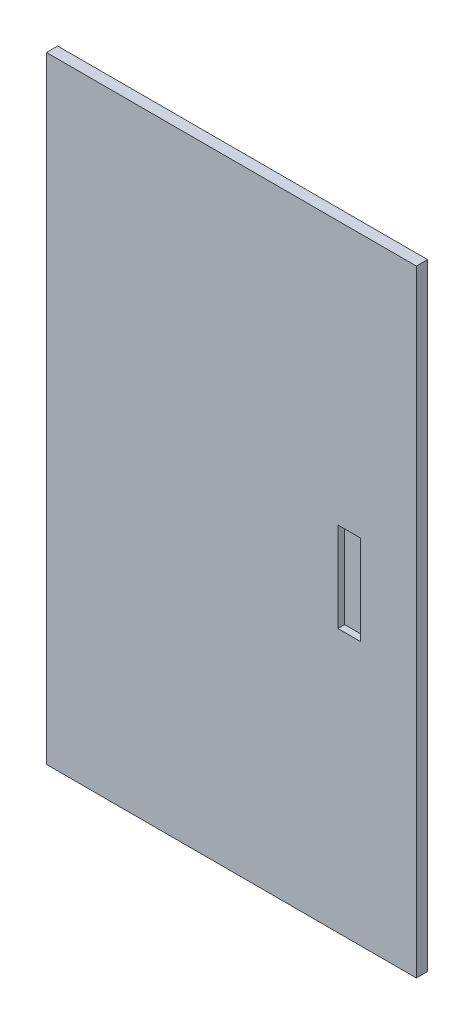
ISO-10303-21;
HEADER;
FILE_DESCRIPTION(('STEP AP214'),'2;1');
FILE_NAME('part.step','',(''),(''),'','','');
FILE_SCHEMA(('AUTOMOTIVE_DESIGN { 1 0 10303 214 1 1 1 1 }'));
ENDSEC;
DATA;
#1=APPLICATION_CONTEXT('core data for automotive mechanical design processes');
#2=APPLICATION_PROTOCOL_DEFINITION('international standard','automotive_design',2000,#1);
#3=PRODUCT_CONTEXT('',#1,'mechanical');
#4=PRODUCT('Part','Part','',(#3));
#5=PRODUCT_RELATED_PRODUCT_CATEGORY('part','',(#4));
#6=PRODUCT_DEFINITION_FORMATION('','',#4);
#7=PRODUCT_DEFINITION_CONTEXT('part definition',#1,'design');
#8=PRODUCT_DEFINITION('design','',#6,#7);
#9=PRODUCT_DEFINITION_SHAPE('','',#8);
#10=(LENGTH_UNIT() NAMED_UNIT(*) SI_UNIT(.MILLI.,.METRE.));
#11=(NAMED_UNIT(*) PLANE_ANGLE_UNIT() SI_UNIT($,.RADIAN.));
#12=(NAMED_UNIT(*) SI_UNIT($,.STERADIAN.) SOLID_ANGLE_UNIT());
#13=UNCERTAINTY_MEASURE_WITH_UNIT(LENGTH_MEASURE(1.E-05),#10,'distance_accuracy_value','');
#14=(GEOMETRIC_REPRESENTATION_CONTEXT(3) GLOBAL_UNCERTAINTY_ASSIGNED_CONTEXT((#13)) GLOBAL_UNIT_ASSIGNED_CONTEXT((#10,
#11,#12)) REPRESENTATION_CONTEXT('',''));
#15=CARTESIAN_POINT('',(0.,0.,0.));
#16=DIRECTION('',(0.,0.,1.));
#17=DIRECTION('',(1.,0.,0.));
#18=AXIS2_PLACEMENT_3D('',#15,#16,#17);
#19=CARTESIAN_POINT('',(209.55,-349.25,12.7));
#20=DIRECTION('',(-1.,0.,0.));
#21=DIRECTION('',(0.,0.,1.));
#22=AXIS2_PLACEMENT_3D('',#19,#20,#21);
#23=PLANE('',#22);
#24=DIRECTION('',(0.,1.,0.));
#25=VECTOR('',#24,1.);
#26=CARTESIAN_POINT('',(209.55,-349.25,0.));
#27=LINE('',#26,#25);
#28=CARTESIAN_POINT('',(209.55,-349.25,0.));
#29=VERTEX_POINT('',#28);
#30=CARTESIAN_POINT('',(209.55,349.25,0.));
#31=VERTEX_POINT('',#30);
#32=EDGE_CURVE('E175',#29,#31,#27,.T.);
#33=ORIENTED_EDGE('',*,*,#32,.T.);
#34=DIRECTION('',(0.,0.,-1.));
#35=VECTOR('',#34,1.);
#36=CARTESIAN_POINT('',(209.55,349.25,12.7));
#37=LINE('',#36,#35);
#38=CARTESIAN_POINT('',(209.55,349.25,12.7));
#39=VERTEX_POINT('',#38);
#40=EDGE_CURVE('E221',#39,#31,#37,.T.);
#41=ORIENTED_EDGE('',*,*,#40,.F.);
#42=DIRECTION('',(0.,1.,0.));
#43=VECTOR('',#42,1.);
#44=CARTESIAN_POINT('',(209.55,-349.25,12.7));
#45=LINE('',#44,#43);
#46=CARTESIAN_POINT('',(209.55,-349.25,12.7));
#47=VERTEX_POINT('',#46);
#48=EDGE_CURVE('E184',#47,#39,#45,.T.);
#49=ORIENTED_EDGE('',*,*,#48,.F.);
#50=DIRECTION('',(0.,0.,-1.));
#51=VECTOR('',#50,1.);
#52=CARTESIAN_POINT('',(209.55,-349.25,12.7));
#53=LINE('',#52,#51);
#54=EDGE_CURVE('E198',#47,#29,#53,.T.);
#55=ORIENTED_EDGE('',*,*,#54,.T.);
#56=EDGE_LOOP('',(#33,#41,#49,#55));
#57=FACE_BOUND('',#56,.T.);
#58=ADVANCED_FACE('F45',(#57),#23,.F.);
#59=CARTESIAN_POINT('',(-209.55,349.25,12.7));
#60=DIRECTION('',(0.,-1.,0.));
#61=DIRECTION('',(0.,0.,-1.));
#62=AXIS2_PLACEMENT_3D('',#59,#60,#61);
#63=PLANE('',#62);
#64=DIRECTION('',(-1.,0.,0.));
#65=VECTOR('',#64,1.);
#66=CARTESIAN_POINT('',(-209.55,349.25,0.));
#67=LINE('',#66,#65);
#68=CARTESIAN_POINT('',(-209.55,349.25,0.));
#69=VERTEX_POINT('',#68);
#70=EDGE_CURVE('E202',#31,#69,#67,.T.);
#71=ORIENTED_EDGE('',*,*,#70,.T.);
#72=DIRECTION('',(0.,0.,-1.));
#73=VECTOR('',#72,1.);
#74=CARTESIAN_POINT('',(-209.55,349.25,12.7));
#75=LINE('',#74,#73);
#76=CARTESIAN_POINT('',(-209.55,349.25,12.7));
#77=VERTEX_POINT('',#76);
#78=EDGE_CURVE('E217',#77,#69,#75,.T.);
#79=ORIENTED_EDGE('',*,*,#78,.F.);
#80=DIRECTION('',(-1.,0.,0.));
#81=VECTOR('',#80,1.);
#82=CARTESIAN_POINT('',(-209.55,349.25,12.7));
#83=LINE('',#82,#81);
#84=EDGE_CURVE('E188',#39,#77,#83,.T.);
#85=ORIENTED_EDGE('',*,*,#84,.F.);
#86=ORIENTED_EDGE('',*,*,#40,.T.);
#87=EDGE_LOOP('',(#71,#79,#85,#86));
#88=FACE_BOUND('',#87,.T.);
#89=ADVANCED_FACE('F246',(#88),#63,.F.);
#90=CARTESIAN_POINT('',(-209.55,-349.25,12.7));
#91=DIRECTION('',(1.,0.,0.));
#92=DIRECTION('',(0.,0.,-1.));
#93=AXIS2_PLACEMENT_3D('',#90,#91,#92);
#94=PLANE('',#93);
#95=DIRECTION('',(0.,-1.,0.));
#96=VECTOR('',#95,1.);
#97=CARTESIAN_POINT('',(-209.55,-349.25,0.));
#98=LINE('',#97,#96);
#99=CARTESIAN_POINT('',(-209.55,-349.25,0.));
#100=VERTEX_POINT('',#99);
#101=EDGE_CURVE('E205',#69,#100,#98,.T.);
#102=ORIENTED_EDGE('',*,*,#101,.T.);
#103=DIRECTION('',(0.,0.,-1.));
#104=VECTOR('',#103,1.);
#105=CARTESIAN_POINT('',(-209.55,-349.25,12.7));
#106=LINE('',#105,#104);
#107=CARTESIAN_POINT('',(-209.55,-349.25,12.7));
#108=VERTEX_POINT('',#107);
#109=EDGE_CURVE('E213',#108,#100,#106,.T.);
#110=ORIENTED_EDGE('',*,*,#109,.F.);
#111=DIRECTION('',(0.,-1.,0.));
#112=VECTOR('',#111,1.);
#113=CARTESIAN_POINT('',(-209.55,-349.25,12.7));
#114=LINE('',#113,#112);
#115=EDGE_CURVE('E192',#77,#108,#114,.T.);
#116=ORIENTED_EDGE('',*,*,#115,.F.);
#117=ORIENTED_EDGE('',*,*,#78,.T.);
#118=EDGE_LOOP('',(#102,#110,#116,#117));
#119=FACE_BOUND('',#118,.T.);
#120=ADVANCED_FACE('F251',(#119),#94,.F.);
#121=CARTESIAN_POINT('',(-209.55,-349.25,12.7));
#122=DIRECTION('',(0.,1.,0.));
#123=DIRECTION('',(0.,0.,1.));
#124=AXIS2_PLACEMENT_3D('',#121,#122,#123);
#125=PLANE('',#124);
#126=DIRECTION('',(1.,0.,0.));
#127=VECTOR('',#126,1.);
#128=CARTESIAN_POINT('',(-209.55,-349.25,0.));
#129=LINE('',#128,#127);
#130=EDGE_CURVE('E189',#100,#29,#129,.T.);
#131=ORIENTED_EDGE('',*,*,#130,.T.);
#132=ORIENTED_EDGE('',*,*,#54,.F.);
#133=DIRECTION('',(1.,0.,0.));
#134=VECTOR('',#133,1.);
#135=CARTESIAN_POINT('',(-209.55,-349.25,12.7));
#136=LINE('',#135,#134);
#137=EDGE_CURVE('E195',#108,#47,#136,.T.);
#138=ORIENTED_EDGE('',*,*,#137,.F.);
#139=ORIENTED_EDGE('',*,*,#109,.T.);
#140=EDGE_LOOP('',(#131,#132,#138,#139));
#141=FACE_BOUND('',#140,.T.);
#142=ADVANCED_FACE('F257',(#141),#125,.F.);
#143=CARTESIAN_POINT('',(0.,0.,12.7));
#144=DIRECTION('',(0.,0.,-1.));
#145=DIRECTION('',(-1.,0.,0.));
#146=AXIS2_PLACEMENT_3D('',#143,#144,#145);
#147=PLANE('',#146);
#148=DIRECTION('',(-1.,0.,0.));
#149=VECTOR('',#148,1.);
#150=CARTESIAN_POINT('',(120.65,50.8,12.7));
#151=LINE('',#150,#149);
#152=CARTESIAN_POINT('',(146.05,50.8,12.7));
#153=VERTEX_POINT('',#152);
#154=CARTESIAN_POINT('',(120.65,50.8,12.7));
#155=VERTEX_POINT('',#154);
#156=EDGE_CURVE('E123',#153,#155,#151,.T.);
#157=ORIENTED_EDGE('',*,*,#156,.F.);
#158=DIRECTION('',(0.,-1.,0.));
#159=VECTOR('',#158,1.);
#160=CARTESIAN_POINT('',(146.05,50.8,12.7));
#161=LINE('',#160,#159);
#162=CARTESIAN_POINT('',(146.05,-50.8,12.7));
#163=VERTEX_POINT('',#162);
#164=EDGE_CURVE('E135',#153,#163,#161,.T.);
#165=ORIENTED_EDGE('',*,*,#164,.T.);
#166=DIRECTION('',(1.,0.,0.));
#167=VECTOR('',#166,1.);
#168=CARTESIAN_POINT('',(120.65,-50.8,12.7));
#169=LINE('',#168,#167);
#170=CARTESIAN_POINT('',(120.65,-50.8,12.7));
#171=VERTEX_POINT('',#170);
#172=EDGE_CURVE('E154',#171,#163,#169,.T.);
#173=ORIENTED_EDGE('',*,*,#172,.F.);
#174=DIRECTION('',(0.,-1.,0.));
#175=VECTOR('',#174,1.);
#176=CARTESIAN_POINT('',(120.65,-50.8,12.7));
#177=LINE('',#176,#175);
#178=EDGE_CURVE('E137',#155,#171,#177,.T.);
#179=ORIENTED_EDGE('',*,*,#178,.F.);
#180=EDGE_LOOP('',(#157,#165,#173,#179));
#181=FACE_BOUND('',#180,.T.);
#182=ORIENTED_EDGE('',*,*,#48,.T.);
#183=ORIENTED_EDGE('',*,*,#84,.T.);
#184=ORIENTED_EDGE('',*,*,#115,.T.);
#185=ORIENTED_EDGE('',*,*,#137,.T.);
#186=EDGE_LOOP('',(#182,#183,#184,#185));
#187=FACE_BOUND('',#186,.T.);
#188=ADVANCED_FACE('F132',(#181,#187),#147,.F.);
#189=CARTESIAN_POINT('',(0.,0.,0.));
#190=DIRECTION('',(0.,0.,-1.));
#191=DIRECTION('',(-1.,0.,0.));
#192=AXIS2_PLACEMENT_3D('',#189,#190,#191);
#193=PLANE('',#192);
#194=ORIENTED_EDGE('',*,*,#32,.F.);
#195=ORIENTED_EDGE('',*,*,#130,.F.);
#196=ORIENTED_EDGE('',*,*,#101,.F.);
#197=ORIENTED_EDGE('',*,*,#70,.F.);
#198=EDGE_LOOP('',(#194,#195,#196,#197));
#199=FACE_BOUND('',#198,.T.);
#200=ADVANCED_FACE('F262',(#199),#193,.T.);
#201=CARTESIAN_POINT('',(158.75,-50.8,5.08));
#202=DIRECTION('',(1.,0.,0.));
#203=DIRECTION('',(0.,0.,-1.));
#204=AXIS2_PLACEMENT_3D('',#201,#202,#203);
#205=PLANE('',#204);
#206=DIRECTION('',(0.,0.,1.));
#207=VECTOR('',#206,1.);
#208=CARTESIAN_POINT('',(158.75,-50.8,5.08));
#209=LINE('',#208,#207);
#210=CARTESIAN_POINT('',(158.75,-50.8,5.08));
#211=VERTEX_POINT('',#210);
#212=CARTESIAN_POINT('',(158.75,-50.8,10.16));
#213=VERTEX_POINT('',#212);
#214=EDGE_CURVE('E171',#211,#213,#209,.T.);
#215=ORIENTED_EDGE('',*,*,#214,.T.);
#216=DIRECTION('',(0.,1.,0.));
#217=VECTOR('',#216,1.);
#218=CARTESIAN_POINT('',(158.75,50.8,10.16));
#219=LINE('',#218,#217);
#220=CARTESIAN_POINT('',(158.75,50.8,10.16));
#221=VERTEX_POINT('',#220);
#222=EDGE_CURVE('E142',#213,#221,#219,.T.);
#223=ORIENTED_EDGE('',*,*,#222,.T.);
#224=DIRECTION('',(0.,0.,1.));
#225=VECTOR('',#224,1.);
#226=CARTESIAN_POINT('',(158.75,50.8,5.08));
#227=LINE('',#226,#225);
#228=CARTESIAN_POINT('',(158.75,50.8,5.08));
#229=VERTEX_POINT('',#228);
#230=EDGE_CURVE('E165',#229,#221,#227,.T.);
#231=ORIENTED_EDGE('',*,*,#230,.F.);
#232=DIRECTION('',(0.,1.,0.));
#233=VECTOR('',#232,1.);
#234=CARTESIAN_POINT('',(158.75,-50.8,5.08));
#235=LINE('',#234,#233);
#236=EDGE_CURVE('E149',#211,#229,#235,.T.);
#237=ORIENTED_EDGE('',*,*,#236,.F.);
#238=EDGE_LOOP('',(#215,#223,#231,#237));
#239=FACE_BOUND('',#238,.T.);
#240=ADVANCED_FACE('F234',(#239),#205,.F.);
#241=CARTESIAN_POINT('',(120.65,-50.8,5.08));
#242=DIRECTION('',(0.,-1.,0.));
#243=DIRECTION('',(1.,0.,0.));
#244=AXIS2_PLACEMENT_3D('',#241,#242,#243);
#245=PLANE('',#244);
#246=ORIENTED_EDGE('',*,*,#172,.T.);
#247=CARTESIAN_POINT('',(148.59,-50.8,12.7));
#248=DIRECTION('',(0.,-1.,0.));
#249=DIRECTION('',(1.,0.,0.));
#250=AXIS2_PLACEMENT_3D('',#247,#248,#249);
#251=CIRCLE('',#250,2.54);
#252=CARTESIAN_POINT('',(148.59,-50.8,10.16));
#253=VERTEX_POINT('',#252);
#254=EDGE_CURVE('E54',#163,#253,#251,.T.);
#255=ORIENTED_EDGE('',*,*,#254,.T.);
#256=DIRECTION('',(1.,0.,0.));
#257=VECTOR('',#256,1.);
#258=CARTESIAN_POINT('',(158.75,-50.8,10.16));
#259=LINE('',#258,#257);
#260=EDGE_CURVE('E139',#253,#213,#259,.T.);
#261=ORIENTED_EDGE('',*,*,#260,.T.);
#262=ORIENTED_EDGE('',*,*,#214,.F.);
#263=DIRECTION('',(1.,0.,0.));
#264=VECTOR('',#263,1.);
#265=CARTESIAN_POINT('',(120.65,-50.8,5.08));
#266=LINE('',#265,#264);
#267=CARTESIAN_POINT('',(120.65,-50.8,5.08));
#268=VERTEX_POINT('',#267);
#269=EDGE_CURVE('E162',#268,#211,#266,.T.);
#270=ORIENTED_EDGE('',*,*,#269,.F.);
#271=DIRECTION('',(0.,0.,1.));
#272=VECTOR('',#271,1.);
#273=CARTESIAN_POINT('',(120.65,-50.8,5.08));
#274=LINE('',#273,#272);
#275=EDGE_CURVE('E176',#268,#171,#274,.T.);
#276=ORIENTED_EDGE('',*,*,#275,.T.);
#277=EDGE_LOOP('',(#246,#255,#261,#262,#270,#276));
#278=FACE_BOUND('',#277,.T.);
#279=ADVANCED_FACE('F229',(#278),#245,.F.);
#280=CARTESIAN_POINT('',(120.65,-50.8,5.08));
#281=DIRECTION('',(-1.,0.,0.));
#282=DIRECTION('',(0.,0.,1.));
#283=AXIS2_PLACEMENT_3D('',#280,#281,#282);
#284=PLANE('',#283);
#285=ORIENTED_EDGE('',*,*,#178,.T.);
#286=ORIENTED_EDGE('',*,*,#275,.F.);
#287=DIRECTION('',(0.,-1.,0.));
#288=VECTOR('',#287,1.);
#289=CARTESIAN_POINT('',(120.65,-50.8,5.08));
#290=LINE('',#289,#288);
#291=CARTESIAN_POINT('',(120.65,50.8,5.08));
#292=VERTEX_POINT('',#291);
#293=EDGE_CURVE('E158',#292,#268,#290,.T.);
#294=ORIENTED_EDGE('',*,*,#293,.F.);
#295=DIRECTION('',(0.,0.,1.));
#296=VECTOR('',#295,1.);
#297=CARTESIAN_POINT('',(120.65,50.8,5.08));
#298=LINE('',#297,#296);
#299=EDGE_CURVE('E179',#292,#155,#298,.T.);
#300=ORIENTED_EDGE('',*,*,#299,.T.);
#301=EDGE_LOOP('',(#285,#286,#294,#300));
#302=FACE_BOUND('',#301,.T.);
#303=ADVANCED_FACE('F272',(#302),#284,.F.);
#304=CARTESIAN_POINT('',(120.65,50.8,5.08));
#305=DIRECTION('',(0.,1.,0.));
#306=DIRECTION('',(0.,0.,1.));
#307=AXIS2_PLACEMENT_3D('',#304,#305,#306);
#308=PLANE('',#307);
#309=DIRECTION('',(-1.,0.,0.));
#310=VECTOR('',#309,1.);
#311=CARTESIAN_POINT('',(158.75,50.8,10.16));
#312=LINE('',#311,#310);
#313=CARTESIAN_POINT('',(148.59,50.8,10.16));
#314=VERTEX_POINT('',#313);
#315=EDGE_CURVE('E126',#221,#314,#312,.T.);
#316=ORIENTED_EDGE('',*,*,#315,.T.);
#317=CARTESIAN_POINT('',(148.59,50.8,12.7));
#318=DIRECTION('',(0.,1.,0.));
#319=DIRECTION('',(0.,0.,1.));
#320=AXIS2_PLACEMENT_3D('',#317,#318,#319);
#321=CIRCLE('',#320,2.54);
#322=EDGE_CURVE('E11',#314,#153,#321,.T.);
#323=ORIENTED_EDGE('',*,*,#322,.T.);
#324=ORIENTED_EDGE('',*,*,#156,.T.);
#325=ORIENTED_EDGE('',*,*,#299,.F.);
#326=DIRECTION('',(-1.,0.,0.));
#327=VECTOR('',#326,1.);
#328=CARTESIAN_POINT('',(120.65,50.8,5.08));
#329=LINE('',#328,#327);
#330=EDGE_CURVE('E153',#229,#292,#329,.T.);
#331=ORIENTED_EDGE('',*,*,#330,.F.);
#332=ORIENTED_EDGE('',*,*,#230,.T.);
#333=EDGE_LOOP('',(#316,#323,#324,#325,#331,#332));
#334=FACE_BOUND('',#333,.T.);
#335=ADVANCED_FACE('F122',(#334),#308,.F.);
#336=CARTESIAN_POINT('',(0.,0.,5.08));
#337=DIRECTION('',(0.,0.,-1.));
#338=DIRECTION('',(-1.,0.,0.));
#339=AXIS2_PLACEMENT_3D('',#336,#337,#338);
#340=PLANE('',#339);
#341=ORIENTED_EDGE('',*,*,#236,.T.);
#342=ORIENTED_EDGE('',*,*,#330,.T.);
#343=ORIENTED_EDGE('',*,*,#293,.T.);
#344=ORIENTED_EDGE('',*,*,#269,.T.);
#345=EDGE_LOOP('',(#341,#342,#343,#344));
#346=FACE_BOUND('',#345,.T.);
#347=ADVANCED_FACE('F237',(#346),#340,.F.);
#348=CARTESIAN_POINT('',(0.,0.,10.16));
#349=DIRECTION('',(0.,0.,-1.));
#350=DIRECTION('',(-1.,0.,0.));
#351=AXIS2_PLACEMENT_3D('',#348,#349,#350);
#352=PLANE('',#351);
#353=ORIENTED_EDGE('',*,*,#260,.F.);
#354=DIRECTION('',(0.,-1.,0.));
#355=VECTOR('',#354,1.);
#356=CARTESIAN_POINT('',(148.59,0.,10.16));
#357=LINE('',#356,#355);
#358=EDGE_CURVE('E61',#253,#314,#357,.F.);
#359=ORIENTED_EDGE('',*,*,#358,.T.);
#360=ORIENTED_EDGE('',*,*,#315,.F.);
#361=ORIENTED_EDGE('',*,*,#222,.F.);
#362=EDGE_LOOP('',(#353,#359,#360,#361));
#363=FACE_BOUND('',#362,.T.);
#364=ADVANCED_FACE('F235',(#363),#352,.T.);
#365=CARTESIAN_POINT('',(148.59,50.8,12.7));
#366=DIRECTION('',(0.,-1.,0.));
#367=DIRECTION('',(0.,0.,-1.));
#368=AXIS2_PLACEMENT_3D('',#365,#366,#367);
#369=CYLINDRICAL_SURFACE('',#368,2.54);
#370=ORIENTED_EDGE('',*,*,#322,.F.);
#371=ORIENTED_EDGE('',*,*,#358,.F.);
#372=ORIENTED_EDGE('',*,*,#254,.F.);
#373=ORIENTED_EDGE('',*,*,#164,.F.);
#374=EDGE_LOOP('',(#370,#371,#372,#373));
#375=FACE_BOUND('',#374,.T.);
#376=ADVANCED_FACE('F47',(#375),#369,.T.);
#377=CLOSED_SHELL('',(#58,#89,#120,#142,#188,#200,#240,#279,#303,#335,#347,#364,#376));
#378=MANIFOLD_SOLID_BREP('B2',#377);
#379=ADVANCED_BREP_SHAPE_REPRESENTATION('',(#18,#378),#14);
#380=SHAPE_DEFINITION_REPRESENTATION(#9,#379);
ENDSEC;
END-ISO-10303-21;
